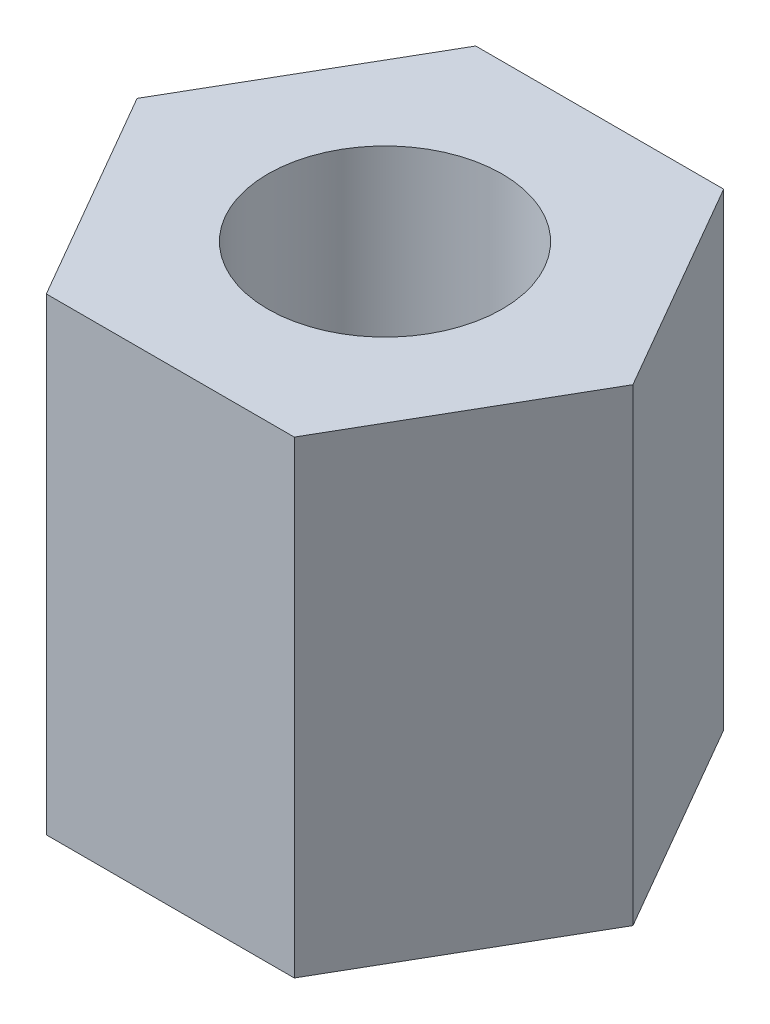
ISO-10303-21;
HEADER;
FILE_DESCRIPTION(('STEP AP214'),'2;1');
FILE_NAME('part.step','',(''),(''),'','','');
FILE_SCHEMA(('AUTOMOTIVE_DESIGN { 1 0 10303 214 1 1 1 1 }'));
ENDSEC;
DATA;
#1=APPLICATION_CONTEXT('core data for automotive mechanical design processes');
#2=APPLICATION_PROTOCOL_DEFINITION('international standard','automotive_design',2000,#1);
#3=PRODUCT_CONTEXT('',#1,'mechanical');
#4=PRODUCT('Part','Part','',(#3));
#5=PRODUCT_RELATED_PRODUCT_CATEGORY('part','',(#4));
#6=PRODUCT_DEFINITION_FORMATION('','',#4);
#7=PRODUCT_DEFINITION_CONTEXT('part definition',#1,'design');
#8=PRODUCT_DEFINITION('design','',#6,#7);
#9=PRODUCT_DEFINITION_SHAPE('','',#8);
#10=(LENGTH_UNIT() NAMED_UNIT(*) SI_UNIT(.MILLI.,.METRE.));
#11=(NAMED_UNIT(*) PLANE_ANGLE_UNIT() SI_UNIT($,.RADIAN.));
#12=(NAMED_UNIT(*) SI_UNIT($,.STERADIAN.) SOLID_ANGLE_UNIT());
#13=UNCERTAINTY_MEASURE_WITH_UNIT(LENGTH_MEASURE(1.E-05),#10,'distance_accuracy_value','');
#14=(GEOMETRIC_REPRESENTATION_CONTEXT(3) GLOBAL_UNCERTAINTY_ASSIGNED_CONTEXT((#13)) GLOBAL_UNIT_ASSIGNED_CONTEXT((#10,
#11,#12)) REPRESENTATION_CONTEXT('',''));
#15=CARTESIAN_POINT('',(0.,0.,0.));
#16=DIRECTION('',(0.,0.,1.));
#17=DIRECTION('',(1.,0.,0.));
#18=AXIS2_PLACEMENT_3D('',#15,#16,#17);
#19=CARTESIAN_POINT('',(0.,6.,0.));
#20=DIRECTION('',(0.,1.,0.));
#21=DIRECTION('',(0.,0.,1.));
#22=AXIS2_PLACEMENT_3D('',#19,#20,#21);
#23=PLANE('',#22);
#24=DIRECTION('',(0.499999999999995,0.,-0.866025403784441));
#25=VECTOR('',#24,1.);
#26=CARTESIAN_POINT('',(1.5877132402715,6.,2.74999999999997));
#27=LINE('',#26,#25);
#28=CARTESIAN_POINT('',(1.5877132402715,6.,2.74999999999997));
#29=VERTEX_POINT('',#28);
#30=CARTESIAN_POINT('',(3.17542648054293,6.,0.));
#31=VERTEX_POINT('',#30);
#32=EDGE_CURVE('E146',#29,#31,#27,.T.);
#33=ORIENTED_EDGE('',*,*,#32,.T.);
#34=DIRECTION('',(-0.500000000000001,0.,-0.866025403784438));
#35=VECTOR('',#34,1.);
#36=CARTESIAN_POINT('',(3.17542648054293,6.,0.));
#37=LINE('',#36,#35);
#38=CARTESIAN_POINT('',(1.58771324027146,6.,-2.74999999999999));
#39=VERTEX_POINT('',#38);
#40=EDGE_CURVE('E94',#31,#39,#37,.T.);
#41=ORIENTED_EDGE('',*,*,#40,.T.);
#42=DIRECTION('',(-1.,0.,0.));
#43=VECTOR('',#42,1.);
#44=CARTESIAN_POINT('',(1.58771324027146,6.,-2.74999999999999));
#45=LINE('',#44,#43);
#46=CARTESIAN_POINT('',(-1.58771324027148,6.,-2.74999999999998));
#47=VERTEX_POINT('',#46);
#48=EDGE_CURVE('E107',#39,#47,#45,.T.);
#49=ORIENTED_EDGE('',*,*,#48,.T.);
#50=DIRECTION('',(-0.499999999999995,0.,0.866025403784442));
#51=VECTOR('',#50,1.);
#52=CARTESIAN_POINT('',(-1.58771324027148,6.,-2.74999999999998));
#53=LINE('',#52,#51);
#54=CARTESIAN_POINT('',(-3.17542648054293,6.,0.));
#55=VERTEX_POINT('',#54);
#56=EDGE_CURVE('E101',#47,#55,#53,.T.);
#57=ORIENTED_EDGE('',*,*,#56,.T.);
#58=DIRECTION('',(0.500000000000007,0.,0.866025403784435));
#59=VECTOR('',#58,1.);
#60=CARTESIAN_POINT('',(-3.17542648054293,6.,0.));
#61=LINE('',#60,#59);
#62=CARTESIAN_POINT('',(-1.58771324027144,6.,2.75));
#63=VERTEX_POINT('',#62);
#64=EDGE_CURVE('E105',#55,#63,#61,.T.);
#65=ORIENTED_EDGE('',*,*,#64,.T.);
#66=DIRECTION('',(1.,0.,0.));
#67=VECTOR('',#66,1.);
#68=CARTESIAN_POINT('',(-1.58771324027144,6.,2.75));
#69=LINE('',#68,#67);
#70=EDGE_CURVE('E57',#63,#29,#69,.T.);
#71=ORIENTED_EDGE('',*,*,#70,.T.);
#72=EDGE_LOOP('',(#33,#41,#49,#57,#65,#71));
#73=FACE_BOUND('',#72,.T.);
#74=CARTESIAN_POINT('',(0.,6.,0.));
#75=DIRECTION('',(0.,1.,0.));
#76=DIRECTION('',(0.,0.,1.));
#77=AXIS2_PLACEMENT_3D('',#74,#75,#76);
#78=CIRCLE('',#77,1.5);
#79=CARTESIAN_POINT('',(0.,6.,1.5));
#80=VERTEX_POINT('',#79);
#81=EDGE_CURVE('E134',#80,#80,#78,.T.);
#82=ORIENTED_EDGE('',*,*,#81,.F.);
#83=EDGE_LOOP('',(#82));
#84=FACE_BOUND('',#83,.T.);
#85=ADVANCED_FACE('F39',(#73,#84),#23,.T.);
#86=CARTESIAN_POINT('',(0.,0.,0.));
#87=DIRECTION('',(0.,1.,0.));
#88=DIRECTION('',(0.,0.,1.));
#89=AXIS2_PLACEMENT_3D('',#86,#87,#88);
#90=PLANE('',#89);
#91=DIRECTION('',(0.499999999999995,0.,-0.866025403784441));
#92=VECTOR('',#91,1.);
#93=CARTESIAN_POINT('',(1.5877132402715,0.,2.74999999999997));
#94=LINE('',#93,#92);
#95=CARTESIAN_POINT('',(1.5877132402715,0.,2.74999999999997));
#96=VERTEX_POINT('',#95);
#97=CARTESIAN_POINT('',(3.17542648054293,0.,0.));
#98=VERTEX_POINT('',#97);
#99=EDGE_CURVE('E129',#96,#98,#94,.T.);
#100=ORIENTED_EDGE('',*,*,#99,.F.);
#101=DIRECTION('',(1.,0.,0.));
#102=VECTOR('',#101,1.);
#103=CARTESIAN_POINT('',(-1.58771324027144,0.,2.75));
#104=LINE('',#103,#102);
#105=CARTESIAN_POINT('',(-1.58771324027144,0.,2.75));
#106=VERTEX_POINT('',#105);
#107=EDGE_CURVE('E86',#106,#96,#104,.T.);
#108=ORIENTED_EDGE('',*,*,#107,.F.);
#109=DIRECTION('',(0.500000000000007,0.,0.866025403784435));
#110=VECTOR('',#109,1.);
#111=CARTESIAN_POINT('',(-3.17542648054293,0.,0.));
#112=LINE('',#111,#110);
#113=CARTESIAN_POINT('',(-3.17542648054293,0.,0.));
#114=VERTEX_POINT('',#113);
#115=EDGE_CURVE('E80',#114,#106,#112,.T.);
#116=ORIENTED_EDGE('',*,*,#115,.F.);
#117=DIRECTION('',(-0.499999999999995,0.,0.866025403784442));
#118=VECTOR('',#117,1.);
#119=CARTESIAN_POINT('',(-1.58771324027148,0.,-2.74999999999998));
#120=LINE('',#119,#118);
#121=CARTESIAN_POINT('',(-1.58771324027148,0.,-2.74999999999998));
#122=VERTEX_POINT('',#121);
#123=EDGE_CURVE('E116',#122,#114,#120,.T.);
#124=ORIENTED_EDGE('',*,*,#123,.F.);
#125=DIRECTION('',(-1.,0.,0.));
#126=VECTOR('',#125,1.);
#127=CARTESIAN_POINT('',(1.58771324027146,0.,-2.74999999999999));
#128=LINE('',#127,#126);
#129=CARTESIAN_POINT('',(1.58771324027146,0.,-2.74999999999999));
#130=VERTEX_POINT('',#129);
#131=EDGE_CURVE('E137',#130,#122,#128,.T.);
#132=ORIENTED_EDGE('',*,*,#131,.F.);
#133=DIRECTION('',(-0.500000000000001,0.,-0.866025403784438));
#134=VECTOR('',#133,1.);
#135=CARTESIAN_POINT('',(3.17542648054293,0.,0.));
#136=LINE('',#135,#134);
#137=EDGE_CURVE('E133',#98,#130,#136,.T.);
#138=ORIENTED_EDGE('',*,*,#137,.F.);
#139=EDGE_LOOP('',(#100,#108,#116,#124,#132,#138));
#140=FACE_BOUND('',#139,.T.);
#141=CARTESIAN_POINT('',(0.,0.,0.));
#142=DIRECTION('',(0.,1.,0.));
#143=DIRECTION('',(0.,0.,1.));
#144=AXIS2_PLACEMENT_3D('',#141,#142,#143);
#145=CIRCLE('',#144,1.5);
#146=CARTESIAN_POINT('',(0.,0.,1.5));
#147=VERTEX_POINT('',#146);
#148=EDGE_CURVE('E243',#147,#147,#145,.T.);
#149=ORIENTED_EDGE('',*,*,#148,.T.);
#150=EDGE_LOOP('',(#149));
#151=FACE_BOUND('',#150,.T.);
#152=ADVANCED_FACE('F159',(#140,#151),#90,.F.);
#153=CARTESIAN_POINT('',(1.5877132402715,6.,2.74999999999997));
#154=DIRECTION('',(-0.866025403784441,0.,-0.499999999999995));
#155=DIRECTION('',(-0.499999999999995,0.,0.866025403784441));
#156=AXIS2_PLACEMENT_3D('',#153,#154,#155);
#157=PLANE('',#156);
#158=ORIENTED_EDGE('',*,*,#99,.T.);
#159=DIRECTION('',(0.,-1.,0.));
#160=VECTOR('',#159,1.);
#161=CARTESIAN_POINT('',(3.17542648054293,6.,0.));
#162=LINE('',#161,#160);
#163=EDGE_CURVE('E11',#31,#98,#162,.T.);
#164=ORIENTED_EDGE('',*,*,#163,.F.);
#165=ORIENTED_EDGE('',*,*,#32,.F.);
#166=DIRECTION('',(0.,-1.,0.));
#167=VECTOR('',#166,1.);
#168=CARTESIAN_POINT('',(1.5877132402715,6.,2.74999999999997));
#169=LINE('',#168,#167);
#170=EDGE_CURVE('E125',#29,#96,#169,.T.);
#171=ORIENTED_EDGE('',*,*,#170,.T.);
#172=EDGE_LOOP('',(#158,#164,#165,#171));
#173=FACE_BOUND('',#172,.T.);
#174=ADVANCED_FACE('F41',(#173),#157,.F.);
#175=CARTESIAN_POINT('',(3.17542648054293,6.,0.));
#176=DIRECTION('',(-0.866025403784438,0.,0.500000000000001));
#177=DIRECTION('',(0.500000000000001,0.,0.866025403784438));
#178=AXIS2_PLACEMENT_3D('',#175,#176,#177);
#179=PLANE('',#178);
#180=ORIENTED_EDGE('',*,*,#137,.T.);
#181=DIRECTION('',(0.,-1.,0.));
#182=VECTOR('',#181,1.);
#183=CARTESIAN_POINT('',(1.58771324027146,6.,-2.74999999999999));
#184=LINE('',#183,#182);
#185=EDGE_CURVE('E49',#39,#130,#184,.T.);
#186=ORIENTED_EDGE('',*,*,#185,.F.);
#187=ORIENTED_EDGE('',*,*,#40,.F.);
#188=ORIENTED_EDGE('',*,*,#163,.T.);
#189=EDGE_LOOP('',(#180,#186,#187,#188));
#190=FACE_BOUND('',#189,.T.);
#191=ADVANCED_FACE('F184',(#190),#179,.F.);
#192=CARTESIAN_POINT('',(1.58771324027146,6.,-2.74999999999999));
#193=DIRECTION('',(0.,0.,1.));
#194=DIRECTION('',(1.,0.,0.));
#195=AXIS2_PLACEMENT_3D('',#192,#193,#194);
#196=PLANE('',#195);
#197=ORIENTED_EDGE('',*,*,#131,.T.);
#198=DIRECTION('',(0.,-1.,0.));
#199=VECTOR('',#198,1.);
#200=CARTESIAN_POINT('',(-1.58771324027148,6.,-2.74999999999998));
#201=LINE('',#200,#199);
#202=EDGE_CURVE('E118',#47,#122,#201,.T.);
#203=ORIENTED_EDGE('',*,*,#202,.F.);
#204=ORIENTED_EDGE('',*,*,#48,.F.);
#205=ORIENTED_EDGE('',*,*,#185,.T.);
#206=EDGE_LOOP('',(#197,#203,#204,#205));
#207=FACE_BOUND('',#206,.T.);
#208=ADVANCED_FACE('F156',(#207),#196,.F.);
#209=CARTESIAN_POINT('',(-1.58771324027148,6.,-2.74999999999998));
#210=DIRECTION('',(0.866025403784441,0.,0.499999999999995));
#211=DIRECTION('',(0.499999999999995,0.,-0.866025403784442));
#212=AXIS2_PLACEMENT_3D('',#209,#210,#211);
#213=PLANE('',#212);
#214=ORIENTED_EDGE('',*,*,#123,.T.);
#215=DIRECTION('',(0.,-1.,0.));
#216=VECTOR('',#215,1.);
#217=CARTESIAN_POINT('',(-3.17542648054293,6.,0.));
#218=LINE('',#217,#216);
#219=EDGE_CURVE('E113',#55,#114,#218,.T.);
#220=ORIENTED_EDGE('',*,*,#219,.F.);
#221=ORIENTED_EDGE('',*,*,#56,.F.);
#222=ORIENTED_EDGE('',*,*,#202,.T.);
#223=EDGE_LOOP('',(#214,#220,#221,#222));
#224=FACE_BOUND('',#223,.T.);
#225=ADVANCED_FACE('F114',(#224),#213,.F.);
#226=CARTESIAN_POINT('',(-3.17542648054293,6.,0.));
#227=DIRECTION('',(0.866025403784435,0.,-0.500000000000007));
#228=DIRECTION('',(-0.500000000000007,0.,-0.866025403784434));
#229=AXIS2_PLACEMENT_3D('',#226,#227,#228);
#230=PLANE('',#229);
#231=ORIENTED_EDGE('',*,*,#115,.T.);
#232=DIRECTION('',(0.,-1.,0.));
#233=VECTOR('',#232,1.);
#234=CARTESIAN_POINT('',(-1.58771324027144,6.,2.75));
#235=LINE('',#234,#233);
#236=EDGE_CURVE('E119',#63,#106,#235,.T.);
#237=ORIENTED_EDGE('',*,*,#236,.F.);
#238=ORIENTED_EDGE('',*,*,#64,.F.);
#239=ORIENTED_EDGE('',*,*,#219,.T.);
#240=EDGE_LOOP('',(#231,#237,#238,#239));
#241=FACE_BOUND('',#240,.T.);
#242=ADVANCED_FACE('F121',(#241),#230,.F.);
#243=CARTESIAN_POINT('',(-1.58771324027144,6.,2.75));
#244=DIRECTION('',(0.,0.,-1.));
#245=DIRECTION('',(-1.,0.,0.));
#246=AXIS2_PLACEMENT_3D('',#243,#244,#245);
#247=PLANE('',#246);
#248=ORIENTED_EDGE('',*,*,#107,.T.);
#249=ORIENTED_EDGE('',*,*,#170,.F.);
#250=ORIENTED_EDGE('',*,*,#70,.F.);
#251=ORIENTED_EDGE('',*,*,#236,.T.);
#252=EDGE_LOOP('',(#248,#249,#250,#251));
#253=FACE_BOUND('',#252,.T.);
#254=ADVANCED_FACE('F164',(#253),#247,.F.);
#255=CARTESIAN_POINT('',(0.,6.,0.));
#256=DIRECTION('',(0.,-1.,0.));
#257=DIRECTION('',(0.,0.,-1.));
#258=AXIS2_PLACEMENT_3D('',#255,#256,#257);
#259=CYLINDRICAL_SURFACE('',#258,1.5);
#260=ORIENTED_EDGE('',*,*,#81,.T.);
#261=EDGE_LOOP('',(#260));
#262=FACE_BOUND('',#261,.T.);
#263=ORIENTED_EDGE('',*,*,#148,.F.);
#264=EDGE_LOOP('',(#263));
#265=FACE_BOUND('',#264,.T.);
#266=ADVANCED_FACE('F166',(#262,#265),#259,.F.);
#267=CLOSED_SHELL('',(#85,#152,#174,#191,#208,#225,#242,#254,#266));
#268=MANIFOLD_SOLID_BREP('B2',#267);
#269=ADVANCED_BREP_SHAPE_REPRESENTATION('',(#18,#268),#14);
#270=SHAPE_DEFINITION_REPRESENTATION(#9,#269);
ENDSEC;
END-ISO-10303-21;
